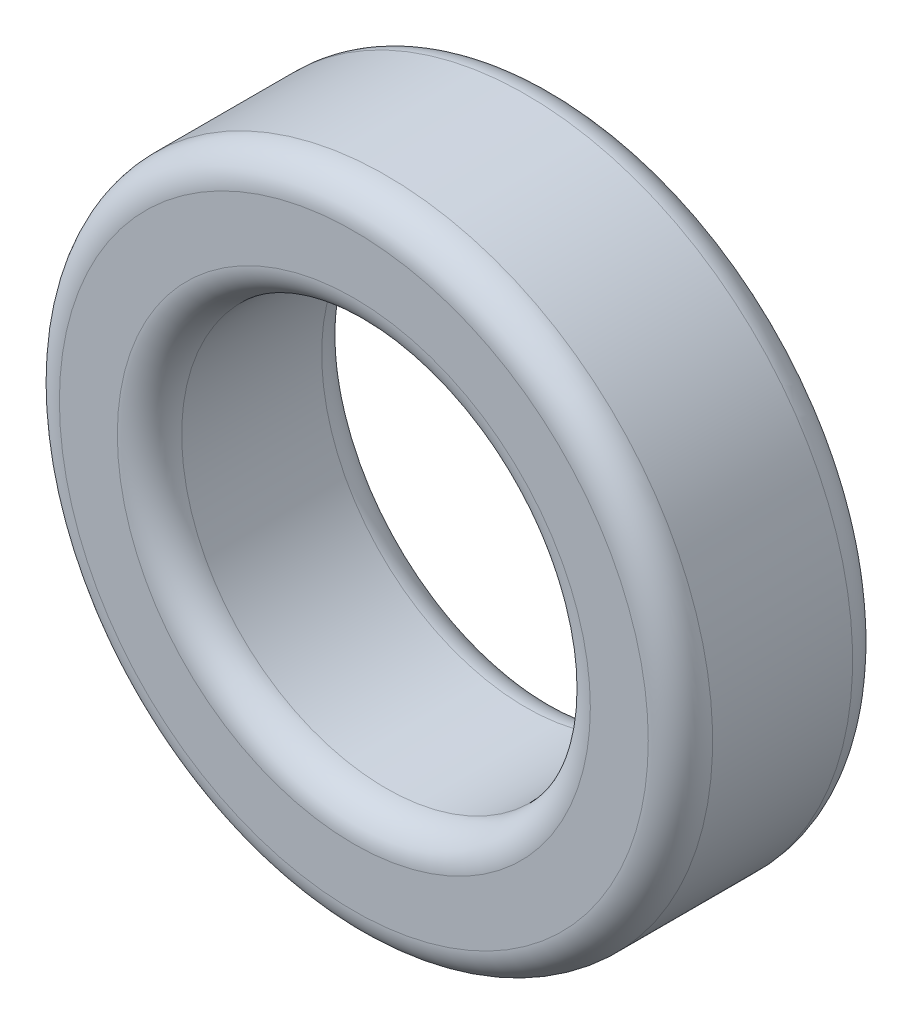
ISO-10303-21;
HEADER;
FILE_DESCRIPTION(('STEP AP214'),'2;1');
FILE_NAME('part.step','',(''),(''),'','','');
FILE_SCHEMA(('AUTOMOTIVE_DESIGN { 1 0 10303 214 1 1 1 1 }'));
ENDSEC;
DATA;
#1=APPLICATION_CONTEXT('core data for automotive mechanical design processes');
#2=APPLICATION_PROTOCOL_DEFINITION('international standard','automotive_design',2000,#1);
#3=PRODUCT_CONTEXT('',#1,'mechanical');
#4=PRODUCT('Part','Part','',(#3));
#5=PRODUCT_RELATED_PRODUCT_CATEGORY('part','',(#4));
#6=PRODUCT_DEFINITION_FORMATION('','',#4);
#7=PRODUCT_DEFINITION_CONTEXT('part definition',#1,'design');
#8=PRODUCT_DEFINITION('design','',#6,#7);
#9=PRODUCT_DEFINITION_SHAPE('','',#8);
#10=(LENGTH_UNIT() NAMED_UNIT(*) SI_UNIT(.MILLI.,.METRE.));
#11=(NAMED_UNIT(*) PLANE_ANGLE_UNIT() SI_UNIT($,.RADIAN.));
#12=(NAMED_UNIT(*) SI_UNIT($,.STERADIAN.) SOLID_ANGLE_UNIT());
#13=UNCERTAINTY_MEASURE_WITH_UNIT(LENGTH_MEASURE(1.E-05),#10,'distance_accuracy_value','');
#14=(GEOMETRIC_REPRESENTATION_CONTEXT(3) GLOBAL_UNCERTAINTY_ASSIGNED_CONTEXT((#13)) GLOBAL_UNIT_ASSIGNED_CONTEXT((#10,
#11,#12)) REPRESENTATION_CONTEXT('',''));
#15=CARTESIAN_POINT('',(0.,0.,0.));
#16=DIRECTION('',(0.,0.,1.));
#17=DIRECTION('',(1.,0.,0.));
#18=AXIS2_PLACEMENT_3D('',#15,#16,#17);
#19=CARTESIAN_POINT('',(0.,0.,3.175));
#20=DIRECTION('',(0.,0.,-1.));
#21=DIRECTION('',(-1.,0.,0.));
#22=AXIS2_PLACEMENT_3D('',#19,#20,#21);
#23=CYLINDRICAL_SURFACE('',#22,6.35);
#24=CARTESIAN_POINT('',(0.,0.,2.175));
#25=DIRECTION('',(0.,0.,1.));
#26=DIRECTION('',(1.,0.,0.));
#27=AXIS2_PLACEMENT_3D('',#24,#25,#26);
#28=CIRCLE('',#27,6.35);
#29=CARTESIAN_POINT('',(6.35,0.,2.175));
#30=VERTEX_POINT('',#29);
#31=EDGE_CURVE('E217',#30,#30,#28,.F.);
#32=ORIENTED_EDGE('',*,*,#31,.F.);
#33=EDGE_LOOP('',(#32));
#34=FACE_BOUND('',#33,.T.);
#35=CARTESIAN_POINT('',(0.,0.,-2.175));
#36=DIRECTION('',(0.,0.,1.));
#37=DIRECTION('',(1.,0.,0.));
#38=AXIS2_PLACEMENT_3D('',#35,#36,#37);
#39=CIRCLE('',#38,6.35);
#40=CARTESIAN_POINT('',(6.35,0.,-2.175));
#41=VERTEX_POINT('',#40);
#42=EDGE_CURVE('E68',#41,#41,#39,.T.);
#43=ORIENTED_EDGE('',*,*,#42,.F.);
#44=EDGE_LOOP('',(#43));
#45=FACE_BOUND('',#44,.T.);
#46=ADVANCED_FACE('F17',(#34,#45),#23,.F.);
#47=CARTESIAN_POINT('',(0.,0.,2.175));
#48=DIRECTION('',(0.,0.,1.));
#49=DIRECTION('',(1.,0.,0.));
#50=AXIS2_PLACEMENT_3D('',#47,#48,#49);
#51=TOROIDAL_SURFACE('',#50,7.35,1.);
#52=ORIENTED_EDGE('',*,*,#31,.T.);
#53=EDGE_LOOP('',(#52));
#54=FACE_BOUND('',#53,.T.);
#55=CARTESIAN_POINT('',(0.,0.,3.175));
#56=DIRECTION('',(0.,0.,1.));
#57=DIRECTION('',(1.,0.,0.));
#58=AXIS2_PLACEMENT_3D('',#55,#56,#57);
#59=CIRCLE('',#58,7.35);
#60=CARTESIAN_POINT('',(-7.35,0.,3.175));
#61=VERTEX_POINT('',#60);
#62=CARTESIAN_POINT('',(7.35,0.,3.175));
#63=VERTEX_POINT('',#62);
#64=EDGE_CURVE('E58',#61,#63,#59,.F.);
#65=ORIENTED_EDGE('',*,*,#64,.F.);
#66=CARTESIAN_POINT('',(0.,0.,3.175));
#67=DIRECTION('',(0.,0.,1.));
#68=DIRECTION('',(-1.,0.,0.));
#69=AXIS2_PLACEMENT_3D('',#66,#67,#68);
#70=CIRCLE('',#69,7.35);
#71=EDGE_CURVE('E56',#63,#61,#70,.F.);
#72=ORIENTED_EDGE('',*,*,#71,.F.);
#73=EDGE_LOOP('',(#65,#72));
#74=FACE_BOUND('',#73,.T.);
#75=ADVANCED_FACE('F60',(#54,#74),#51,.T.);
#76=CARTESIAN_POINT('',(0.,0.,-2.175));
#77=DIRECTION('',(0.,0.,1.));
#78=DIRECTION('',(1.,0.,0.));
#79=AXIS2_PLACEMENT_3D('',#76,#77,#78);
#80=TOROIDAL_SURFACE('',#79,7.35,1.);
#81=CARTESIAN_POINT('',(0.,0.,-3.175));
#82=DIRECTION('',(0.,0.,-1.));
#83=DIRECTION('',(1.,0.,0.));
#84=AXIS2_PLACEMENT_3D('',#81,#82,#83);
#85=CIRCLE('',#84,7.35);
#86=CARTESIAN_POINT('',(7.35,0.,-3.175));
#87=VERTEX_POINT('',#86);
#88=CARTESIAN_POINT('',(-7.35,0.,-3.175));
#89=VERTEX_POINT('',#88);
#90=EDGE_CURVE('E63',#87,#89,#85,.T.);
#91=ORIENTED_EDGE('',*,*,#90,.T.);
#92=CARTESIAN_POINT('',(0.,0.,-3.175));
#93=DIRECTION('',(0.,0.,-1.));
#94=DIRECTION('',(-1.,0.,0.));
#95=AXIS2_PLACEMENT_3D('',#92,#93,#94);
#96=CIRCLE('',#95,7.35);
#97=EDGE_CURVE('E158',#89,#87,#96,.T.);
#98=ORIENTED_EDGE('',*,*,#97,.T.);
#99=EDGE_LOOP('',(#91,#98));
#100=FACE_BOUND('',#99,.T.);
#101=ORIENTED_EDGE('',*,*,#42,.T.);
#102=EDGE_LOOP('',(#101));
#103=FACE_BOUND('',#102,.T.);
#104=ADVANCED_FACE('F89',(#100,#103),#80,.T.);
#105=CARTESIAN_POINT('',(0.,0.,3.175));
#106=DIRECTION('',(0.,0.,1.));
#107=DIRECTION('',(1.,0.,0.));
#108=AXIS2_PLACEMENT_3D('',#105,#106,#107);
#109=PLANE('',#108);
#110=CARTESIAN_POINT('',(0.,0.,3.175));
#111=DIRECTION('',(0.,0.,-1.));
#112=DIRECTION('',(-1.,0.,0.));
#113=AXIS2_PLACEMENT_3D('',#110,#111,#112);
#114=CIRCLE('',#113,9.15);
#115=CARTESIAN_POINT('',(-9.15,0.,3.175));
#116=VERTEX_POINT('',#115);
#117=CARTESIAN_POINT('',(9.15,0.,3.175));
#118=VERTEX_POINT('',#117);
#119=EDGE_CURVE('E124',#116,#118,#114,.T.);
#120=ORIENTED_EDGE('',*,*,#119,.F.);
#121=CARTESIAN_POINT('',(0.,0.,3.175));
#122=DIRECTION('',(0.,0.,-1.));
#123=DIRECTION('',(1.,0.,0.));
#124=AXIS2_PLACEMENT_3D('',#121,#122,#123);
#125=CIRCLE('',#124,9.15);
#126=EDGE_CURVE('E112',#118,#116,#125,.T.);
#127=ORIENTED_EDGE('',*,*,#126,.F.);
#128=EDGE_LOOP('',(#120,#127));
#129=FACE_BOUND('',#128,.T.);
#130=ORIENTED_EDGE('',*,*,#71,.T.);
#131=ORIENTED_EDGE('',*,*,#64,.T.);
#132=EDGE_LOOP('',(#130,#131));
#133=FACE_BOUND('',#132,.T.);
#134=ADVANCED_FACE('F67',(#129,#133),#109,.T.);
#135=CARTESIAN_POINT('',(0.,0.,-3.175));
#136=DIRECTION('',(0.,0.,1.));
#137=DIRECTION('',(1.,0.,0.));
#138=AXIS2_PLACEMENT_3D('',#135,#136,#137);
#139=PLANE('',#138);
#140=CARTESIAN_POINT('',(0.,0.,-3.175));
#141=DIRECTION('',(0.,0.,1.));
#142=DIRECTION('',(1.,0.,0.));
#143=AXIS2_PLACEMENT_3D('',#140,#141,#142);
#144=CIRCLE('',#143,9.15);
#145=CARTESIAN_POINT('',(9.15,0.,-3.175));
#146=VERTEX_POINT('',#145);
#147=CARTESIAN_POINT('',(-9.15,0.,-3.175));
#148=VERTEX_POINT('',#147);
#149=EDGE_CURVE('E168',#146,#148,#144,.T.);
#150=ORIENTED_EDGE('',*,*,#149,.F.);
#151=CARTESIAN_POINT('',(0.,0.,-3.175));
#152=DIRECTION('',(0.,0.,1.));
#153=DIRECTION('',(-1.,0.,0.));
#154=AXIS2_PLACEMENT_3D('',#151,#152,#153);
#155=CIRCLE('',#154,9.15);
#156=EDGE_CURVE('E35',#148,#146,#155,.T.);
#157=ORIENTED_EDGE('',*,*,#156,.F.);
#158=EDGE_LOOP('',(#150,#157));
#159=FACE_BOUND('',#158,.T.);
#160=ORIENTED_EDGE('',*,*,#90,.F.);
#161=ORIENTED_EDGE('',*,*,#97,.F.);
#162=EDGE_LOOP('',(#160,#161));
#163=FACE_BOUND('',#162,.T.);
#164=ADVANCED_FACE('F88',(#159,#163),#139,.F.);
#165=CARTESIAN_POINT('',(0.,0.,2.175));
#166=DIRECTION('',(0.,0.,1.));
#167=DIRECTION('',(1.,0.,0.));
#168=AXIS2_PLACEMENT_3D('',#165,#166,#167);
#169=TOROIDAL_SURFACE('',#168,9.15,1.);
#170=ORIENTED_EDGE('',*,*,#126,.T.);
#171=ORIENTED_EDGE('',*,*,#119,.T.);
#172=EDGE_LOOP('',(#170,#171));
#173=FACE_BOUND('',#172,.T.);
#174=CARTESIAN_POINT('',(0.,0.,2.175));
#175=DIRECTION('',(0.,0.,-1.));
#176=DIRECTION('',(-1.,0.,0.));
#177=AXIS2_PLACEMENT_3D('',#174,#175,#176);
#178=CIRCLE('',#177,10.15);
#179=CARTESIAN_POINT('',(-10.15,0.,2.175));
#180=VERTEX_POINT('',#179);
#181=EDGE_CURVE('E27',#180,#180,#178,.T.);
#182=ORIENTED_EDGE('',*,*,#181,.F.);
#183=EDGE_LOOP('',(#182));
#184=FACE_BOUND('',#183,.T.);
#185=ADVANCED_FACE('F128',(#173,#184),#169,.T.);
#186=CARTESIAN_POINT('',(0.,0.,-2.175));
#187=DIRECTION('',(0.,0.,1.));
#188=DIRECTION('',(1.,0.,0.));
#189=AXIS2_PLACEMENT_3D('',#186,#187,#188);
#190=TOROIDAL_SURFACE('',#189,9.15,1.);
#191=CARTESIAN_POINT('',(0.,0.,-2.175));
#192=DIRECTION('',(0.,0.,-1.));
#193=DIRECTION('',(-1.,0.,0.));
#194=AXIS2_PLACEMENT_3D('',#191,#192,#193);
#195=CIRCLE('',#194,10.15);
#196=CARTESIAN_POINT('',(-10.15,0.,-2.175));
#197=VERTEX_POINT('',#196);
#198=EDGE_CURVE('E11',#197,#197,#195,.F.);
#199=ORIENTED_EDGE('',*,*,#198,.F.);
#200=EDGE_LOOP('',(#199));
#201=FACE_BOUND('',#200,.T.);
#202=ORIENTED_EDGE('',*,*,#149,.T.);
#203=ORIENTED_EDGE('',*,*,#156,.T.);
#204=EDGE_LOOP('',(#202,#203));
#205=FACE_BOUND('',#204,.T.);
#206=ADVANCED_FACE('F137',(#201,#205),#190,.T.);
#207=CARTESIAN_POINT('',(0.,0.,3.175));
#208=DIRECTION('',(0.,0.,-1.));
#209=DIRECTION('',(-1.,0.,0.));
#210=AXIS2_PLACEMENT_3D('',#207,#208,#209);
#211=CYLINDRICAL_SURFACE('',#210,10.15);
#212=ORIENTED_EDGE('',*,*,#198,.T.);
#213=EDGE_LOOP('',(#212));
#214=FACE_BOUND('',#213,.T.);
#215=ORIENTED_EDGE('',*,*,#181,.T.);
#216=EDGE_LOOP('',(#215));
#217=FACE_BOUND('',#216,.T.);
#218=ADVANCED_FACE('F248',(#214,#217),#211,.T.);
#219=CLOSED_SHELL('',(#46,#75,#104,#134,#164,#185,#206,#218));
#220=MANIFOLD_SOLID_BREP('B1',#219);
#221=ADVANCED_BREP_SHAPE_REPRESENTATION('',(#18,#220),#14);
#222=SHAPE_DEFINITION_REPRESENTATION(#9,#221);
ENDSEC;
END-ISO-10303-21;
